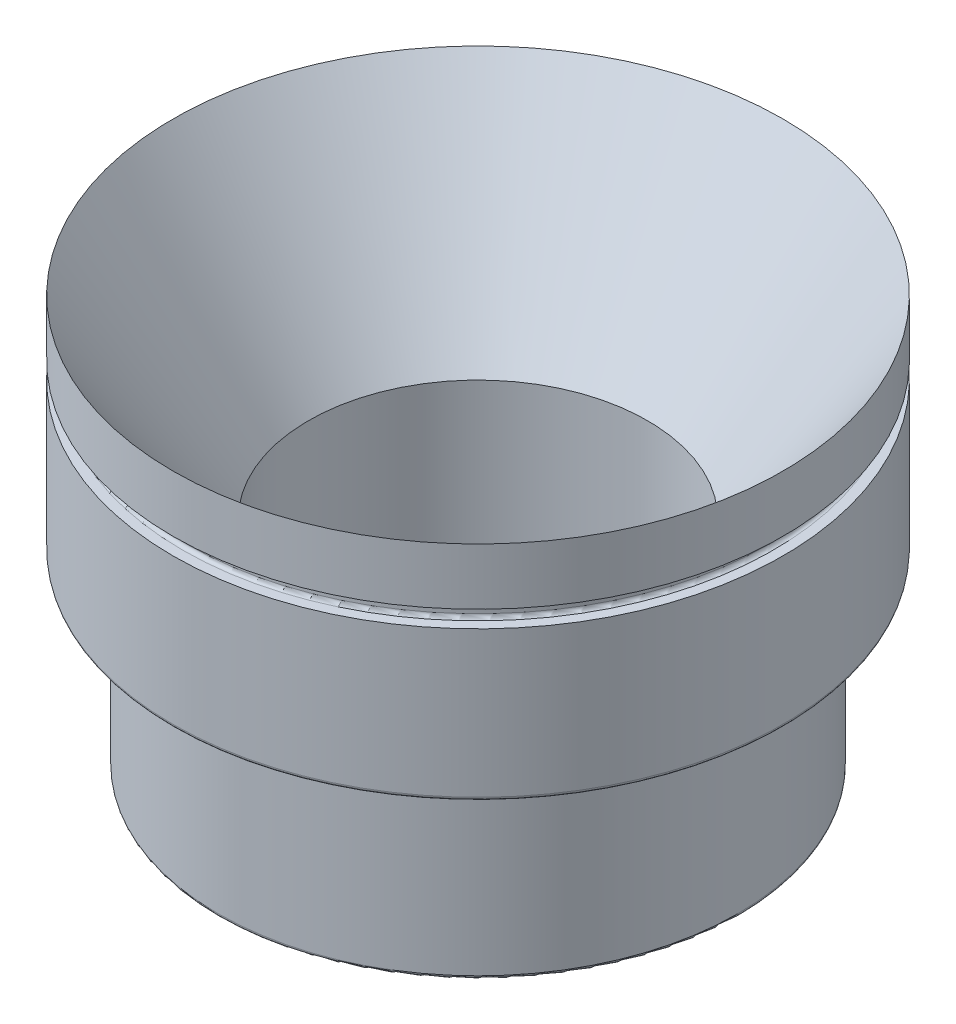
ISO-10303-21;
HEADER;
FILE_DESCRIPTION(('STEP AP214'),'2;1');
FILE_NAME('part.step','',(''),(''),'','','');
FILE_SCHEMA(('AUTOMOTIVE_DESIGN { 1 0 10303 214 1 1 1 1 }'));
ENDSEC;
DATA;
#1=APPLICATION_CONTEXT('core data for automotive mechanical design processes');
#2=APPLICATION_PROTOCOL_DEFINITION('international standard','automotive_design',2000,#1);
#3=PRODUCT_CONTEXT('',#1,'mechanical');
#4=PRODUCT('Part','Part','',(#3));
#5=PRODUCT_RELATED_PRODUCT_CATEGORY('part','',(#4));
#6=PRODUCT_DEFINITION_FORMATION('','',#4);
#7=PRODUCT_DEFINITION_CONTEXT('part definition',#1,'design');
#8=PRODUCT_DEFINITION('design','',#6,#7);
#9=PRODUCT_DEFINITION_SHAPE('','',#8);
#10=(LENGTH_UNIT() NAMED_UNIT(*) SI_UNIT(.MILLI.,.METRE.));
#11=(NAMED_UNIT(*) PLANE_ANGLE_UNIT() SI_UNIT($,.RADIAN.));
#12=(NAMED_UNIT(*) SI_UNIT($,.STERADIAN.) SOLID_ANGLE_UNIT());
#13=UNCERTAINTY_MEASURE_WITH_UNIT(LENGTH_MEASURE(1.E-05),#10,'distance_accuracy_value','');
#14=(GEOMETRIC_REPRESENTATION_CONTEXT(3) GLOBAL_UNCERTAINTY_ASSIGNED_CONTEXT((#13)) GLOBAL_UNIT_ASSIGNED_CONTEXT((#10,
#11,#12)) REPRESENTATION_CONTEXT('',''));
#15=CARTESIAN_POINT('',(0.,0.,0.));
#16=DIRECTION('',(0.,0.,1.));
#17=DIRECTION('',(1.,0.,0.));
#18=AXIS2_PLACEMENT_3D('',#15,#16,#17);
#19=CARTESIAN_POINT('',(0.,0.,0.));
#20=DIRECTION('',(0.,1.,0.));
#21=DIRECTION('',(0.,0.,1.));
#22=AXIS2_PLACEMENT_3D('',#19,#20,#21);
#23=CYLINDRICAL_SURFACE('',#22,34.2773);
#24=CARTESIAN_POINT('',(0.,0.,0.));
#25=DIRECTION('',(0.,1.,0.));
#26=DIRECTION('',(0.,0.,1.));
#27=AXIS2_PLACEMENT_3D('',#24,#25,#26);
#28=CIRCLE('',#27,34.2773);
#29=CARTESIAN_POINT('',(0.,0.,34.2773));
#30=VERTEX_POINT('',#29);
#31=EDGE_CURVE('E78',#30,#30,#28,.T.);
#32=ORIENTED_EDGE('',*,*,#31,.F.);
#33=EDGE_LOOP('',(#32));
#34=FACE_BOUND('',#33,.T.);
#35=CARTESIAN_POINT('',(0.,-6.35,0.));
#36=DIRECTION('',(0.,1.,0.));
#37=DIRECTION('',(0.,0.,1.));
#38=AXIS2_PLACEMENT_3D('',#35,#36,#37);
#39=CIRCLE('',#38,34.2773);
#40=CARTESIAN_POINT('',(0.,-6.35000000000001,34.2773));
#41=VERTEX_POINT('',#40);
#42=EDGE_CURVE('E87',#41,#41,#39,.T.);
#43=ORIENTED_EDGE('',*,*,#42,.T.);
#44=EDGE_LOOP('',(#43));
#45=FACE_BOUND('',#44,.T.);
#46=ADVANCED_FACE('F37',(#34,#45),#23,.T.);
#47=CARTESIAN_POINT('',(0.,-24.6440568424667,0.));
#48=DIRECTION('',(0.,1.,0.));
#49=DIRECTION('',(0.,0.,1.));
#50=AXIS2_PLACEMENT_3D('',#47,#48,#49);
#51=CIRCLE('',#50,34.2773);
#52=CARTESIAN_POINT('',(0.,-24.6440568424667,34.2773));
#53=VERTEX_POINT('',#52);
#54=EDGE_CURVE('E10',#53,#53,#51,.T.);
#55=ORIENTED_EDGE('',*,*,#54,.T.);
#56=EDGE_LOOP('',(#55));
#57=FACE_BOUND('',#56,.T.);
#58=CARTESIAN_POINT('',(0.,-8.25500000000001,0.));
#59=DIRECTION('',(0.,1.,0.));
#60=DIRECTION('',(0.,0.,1.));
#61=AXIS2_PLACEMENT_3D('',#58,#59,#60);
#62=CIRCLE('',#61,34.2773);
#63=CARTESIAN_POINT('',(0.,-8.25500000000001,34.2773));
#64=VERTEX_POINT('',#63);
#65=EDGE_CURVE('E90',#64,#64,#62,.T.);
#66=ORIENTED_EDGE('',*,*,#65,.F.);
#67=EDGE_LOOP('',(#66));
#68=FACE_BOUND('',#67,.T.);
#69=ADVANCED_FACE('F96',(#57,#68),#23,.T.);
#70=CARTESIAN_POINT('',(0.,0.,0.));
#71=DIRECTION('',(0.,1.,0.));
#72=DIRECTION('',(0.,0.,1.));
#73=AXIS2_PLACEMENT_3D('',#70,#71,#72);
#74=CYLINDRICAL_SURFACE('',#73,19.05);
#75=CARTESIAN_POINT('',(0.,-38.1492575019381,0.));
#76=DIRECTION('',(0.,1.,0.));
#77=DIRECTION('',(0.,0.,1.));
#78=AXIS2_PLACEMENT_3D('',#75,#76,#77);
#79=CIRCLE('',#78,19.05);
#80=CARTESIAN_POINT('',(0.,-38.1492575019381,19.05));
#81=VERTEX_POINT('',#80);
#82=EDGE_CURVE('E84',#81,#81,#79,.T.);
#83=ORIENTED_EDGE('',*,*,#82,.F.);
#84=EDGE_LOOP('',(#83));
#85=FACE_BOUND('',#84,.T.);
#86=CARTESIAN_POINT('',(0.,-21.7468381430641,0.));
#87=DIRECTION('',(0.,1.,0.));
#88=DIRECTION('',(0.,0.,1.));
#89=AXIS2_PLACEMENT_3D('',#86,#87,#88);
#90=CIRCLE('',#89,19.05);
#91=CARTESIAN_POINT('',(0.,-21.7468381430641,19.05));
#92=VERTEX_POINT('',#91);
#93=EDGE_CURVE('E75',#92,#92,#90,.T.);
#94=ORIENTED_EDGE('',*,*,#93,.T.);
#95=EDGE_LOOP('',(#94));
#96=FACE_BOUND('',#95,.T.);
#97=ADVANCED_FACE('F98',(#85,#96),#74,.F.);
#98=CARTESIAN_POINT('',(0.,0.,0.));
#99=DIRECTION('',(0.,1.,0.));
#100=DIRECTION('',(0.,0.,1.));
#101=AXIS2_PLACEMENT_3D('',#98,#99,#100);
#102=CONICAL_SURFACE('',#101,34.2773,0.610865238198017);
#103=ORIENTED_EDGE('',*,*,#93,.F.);
#104=EDGE_LOOP('',(#103));
#105=FACE_BOUND('',#104,.T.);
#106=ORIENTED_EDGE('',*,*,#31,.T.);
#107=EDGE_LOOP('',(#106));
#108=FACE_BOUND('',#107,.T.);
#109=ADVANCED_FACE('F105',(#105,#108),#102,.F.);
#110=CARTESIAN_POINT('',(0.,-25.0504568424667,-34.2773));
#111=DIRECTION('',(0.,1.,0.));
#112=DIRECTION('',(0.,0.,1.));
#113=AXIS2_PLACEMENT_3D('',#110,#111,#112);
#114=PLANE('',#113);
#115=CARTESIAN_POINT('',(0.,-25.0504568424667,0.));
#116=DIRECTION('',(0.,1.,0.));
#117=DIRECTION('',(0.,0.,1.));
#118=AXIS2_PLACEMENT_3D('',#115,#116,#117);
#119=CIRCLE('',#118,29.591);
#120=CARTESIAN_POINT('',(0.,-25.0504568424667,29.591));
#121=VERTEX_POINT('',#120);
#122=EDGE_CURVE('E57',#121,#121,#119,.T.);
#123=ORIENTED_EDGE('',*,*,#122,.T.);
#124=EDGE_LOOP('',(#123));
#125=FACE_BOUND('',#124,.T.);
#126=CARTESIAN_POINT('',(0.,-25.0504568424667,0.));
#127=DIRECTION('',(0.,1.,0.));
#128=DIRECTION('',(0.,0.,1.));
#129=AXIS2_PLACEMENT_3D('',#126,#127,#128);
#130=CIRCLE('',#129,33.8709);
#131=CARTESIAN_POINT('',(0.,-25.0504568424667,33.8709));
#132=VERTEX_POINT('',#131);
#133=EDGE_CURVE('E60',#132,#132,#130,.F.);
#134=ORIENTED_EDGE('',*,*,#133,.T.);
#135=EDGE_LOOP('',(#134));
#136=FACE_BOUND('',#135,.T.);
#137=ADVANCED_FACE('F111',(#125,#136),#114,.F.);
#138=CARTESIAN_POINT('',(0.,0.,0.));
#139=DIRECTION('',(0.,1.,0.));
#140=DIRECTION('',(0.,0.,1.));
#141=AXIS2_PLACEMENT_3D('',#138,#139,#140);
#142=CYLINDRICAL_SURFACE('',#141,29.1846);
#143=CARTESIAN_POINT('',(0.,-25.4568568424667,0.));
#144=DIRECTION('',(0.,1.,0.));
#145=DIRECTION('',(0.,0.,1.));
#146=AXIS2_PLACEMENT_3D('',#143,#144,#145);
#147=CIRCLE('',#146,29.1846);
#148=CARTESIAN_POINT('',(0.,-25.4568568424667,29.1846));
#149=VERTEX_POINT('',#148);
#150=EDGE_CURVE('E48',#149,#149,#147,.F.);
#151=ORIENTED_EDGE('',*,*,#150,.T.);
#152=EDGE_LOOP('',(#151));
#153=FACE_BOUND('',#152,.T.);
#154=CARTESIAN_POINT('',(0.,-45.6244568418987,0.));
#155=DIRECTION('',(0.,1.,0.));
#156=DIRECTION('',(0.,0.,1.));
#157=AXIS2_PLACEMENT_3D('',#154,#155,#156);
#158=CIRCLE('',#157,29.1846);
#159=CARTESIAN_POINT('',(0.,-45.6244568418987,29.1846));
#160=VERTEX_POINT('',#159);
#161=EDGE_CURVE('E52',#160,#160,#158,.T.);
#162=ORIENTED_EDGE('',*,*,#161,.T.);
#163=EDGE_LOOP('',(#162));
#164=FACE_BOUND('',#163,.T.);
#165=ADVANCED_FACE('F137',(#153,#164),#142,.T.);
#166=CARTESIAN_POINT('',(0.,-46.0308568418987,-29.1846));
#167=DIRECTION('',(0.,1.,0.));
#168=DIRECTION('',(0.,0.,1.));
#169=AXIS2_PLACEMENT_3D('',#166,#167,#168);
#170=PLANE('',#169);
#171=CARTESIAN_POINT('',(0.,-46.0308568418987,0.));
#172=DIRECTION('',(0.,1.,0.));
#173=DIRECTION('',(0.,0.,1.));
#174=AXIS2_PLACEMENT_3D('',#171,#172,#173);
#175=CIRCLE('',#174,28.7782);
#176=CARTESIAN_POINT('',(0.,-46.0308568418987,28.7782));
#177=VERTEX_POINT('',#176);
#178=EDGE_CURVE('E44',#177,#177,#175,.F.);
#179=ORIENTED_EDGE('',*,*,#178,.T.);
#180=EDGE_LOOP('',(#179));
#181=FACE_BOUND('',#180,.T.);
#182=CARTESIAN_POINT('',(0.,-46.0308568418987,0.));
#183=DIRECTION('',(0.,1.,0.));
#184=DIRECTION('',(0.,0.,1.));
#185=AXIS2_PLACEMENT_3D('',#182,#183,#184);
#186=CIRCLE('',#185,20.3822334431976);
#187=CARTESIAN_POINT('',(0.,-46.0308568418987,20.3822334431976));
#188=VERTEX_POINT('',#187);
#189=EDGE_CURVE('E81',#188,#188,#186,.T.);
#190=ORIENTED_EDGE('',*,*,#189,.T.);
#191=EDGE_LOOP('',(#190));
#192=FACE_BOUND('',#191,.T.);
#193=ADVANCED_FACE('F139',(#181,#192),#170,.F.);
#194=CARTESIAN_POINT('',(0.,-38.1492575019381,0.));
#195=DIRECTION('',(0.,-1.,0.));
#196=DIRECTION('',(0.,0.,-1.));
#197=AXIS2_PLACEMENT_3D('',#194,#195,#196);
#198=CONICAL_SURFACE('',#197,19.05,0.167448079213641);
#199=ORIENTED_EDGE('',*,*,#189,.F.);
#200=EDGE_LOOP('',(#199));
#201=FACE_BOUND('',#200,.T.);
#202=ORIENTED_EDGE('',*,*,#82,.T.);
#203=EDGE_LOOP('',(#202));
#204=FACE_BOUND('',#203,.T.);
#205=ADVANCED_FACE('F144',(#201,#204),#198,.F.);
#206=CARTESIAN_POINT('',(0.,-6.35,-34.2773));
#207=DIRECTION('',(0.,-1.,0.));
#208=DIRECTION('',(0.,0.,-1.));
#209=AXIS2_PLACEMENT_3D('',#206,#207,#208);
#210=PLANE('',#209);
#211=CARTESIAN_POINT('',(0.,-6.35,0.));
#212=DIRECTION('',(0.,-1.,0.));
#213=DIRECTION('',(0.,0.,-1.));
#214=AXIS2_PLACEMENT_3D('',#211,#212,#213);
#215=CIRCLE('',#214,33.1724);
#216=CARTESIAN_POINT('',(0.,-6.35,-33.1724));
#217=VERTEX_POINT('',#216);
#218=EDGE_CURVE('E72',#217,#217,#215,.F.);
#219=ORIENTED_EDGE('',*,*,#218,.T.);
#220=EDGE_LOOP('',(#219));
#221=FACE_BOUND('',#220,.T.);
#222=ORIENTED_EDGE('',*,*,#42,.F.);
#223=EDGE_LOOP('',(#222));
#224=FACE_BOUND('',#223,.T.);
#225=ADVANCED_FACE('F150',(#221,#224),#210,.T.);
#226=CARTESIAN_POINT('',(0.,11.364369062704,0.));
#227=DIRECTION('',(0.,1.,0.));
#228=DIRECTION('',(0.,0.,1.));
#229=AXIS2_PLACEMENT_3D('',#226,#227,#228);
#230=CYLINDRICAL_SURFACE('',#229,32.766);
#231=CARTESIAN_POINT('',(0.,-6.7564,0.));
#232=DIRECTION('',(0.,-1.,0.));
#233=DIRECTION('',(0.,0.,-1.));
#234=AXIS2_PLACEMENT_3D('',#231,#232,#233);
#235=CIRCLE('',#234,32.766);
#236=CARTESIAN_POINT('',(0.,-6.7564,-32.766));
#237=VERTEX_POINT('',#236);
#238=EDGE_CURVE('E66',#237,#237,#235,.T.);
#239=ORIENTED_EDGE('',*,*,#238,.T.);
#240=EDGE_LOOP('',(#239));
#241=FACE_BOUND('',#240,.T.);
#242=CARTESIAN_POINT('',(0.,-7.8486,0.));
#243=DIRECTION('',(0.,1.,0.));
#244=DIRECTION('',(0.,0.,1.));
#245=AXIS2_PLACEMENT_3D('',#242,#243,#244);
#246=CIRCLE('',#245,32.766);
#247=CARTESIAN_POINT('',(0.,-7.84860000000001,32.766));
#248=VERTEX_POINT('',#247);
#249=EDGE_CURVE('E69',#248,#248,#246,.T.);
#250=ORIENTED_EDGE('',*,*,#249,.T.);
#251=EDGE_LOOP('',(#250));
#252=FACE_BOUND('',#251,.T.);
#253=ADVANCED_FACE('F154',(#241,#252),#230,.T.);
#254=CARTESIAN_POINT('',(0.,-8.255,-32.766));
#255=DIRECTION('',(0.,1.,0.));
#256=DIRECTION('',(0.,0.,1.));
#257=AXIS2_PLACEMENT_3D('',#254,#255,#256);
#258=PLANE('',#257);
#259=CARTESIAN_POINT('',(0.,-8.25500000000001,0.));
#260=DIRECTION('',(0.,1.,0.));
#261=DIRECTION('',(0.,0.,1.));
#262=AXIS2_PLACEMENT_3D('',#259,#260,#261);
#263=CIRCLE('',#262,33.1724);
#264=CARTESIAN_POINT('',(0.,-8.25500000000001,33.1724));
#265=VERTEX_POINT('',#264);
#266=EDGE_CURVE('E63',#265,#265,#263,.F.);
#267=ORIENTED_EDGE('',*,*,#266,.T.);
#268=EDGE_LOOP('',(#267));
#269=FACE_BOUND('',#268,.T.);
#270=ORIENTED_EDGE('',*,*,#65,.T.);
#271=EDGE_LOOP('',(#270));
#272=FACE_BOUND('',#271,.T.);
#273=ADVANCED_FACE('F94',(#269,#272),#258,.T.);
#274=CARTESIAN_POINT('',(0.,-6.7564,0.));
#275=DIRECTION('',(0.,-1.,0.));
#276=DIRECTION('',(0.,0.,-1.));
#277=AXIS2_PLACEMENT_3D('',#274,#275,#276);
#278=TOROIDAL_SURFACE('',#277,33.1724,0.4064);
#279=ORIENTED_EDGE('',*,*,#238,.F.);
#280=EDGE_LOOP('',(#279));
#281=FACE_BOUND('',#280,.T.);
#282=ORIENTED_EDGE('',*,*,#218,.F.);
#283=EDGE_LOOP('',(#282));
#284=FACE_BOUND('',#283,.T.);
#285=ADVANCED_FACE('F116',(#281,#284),#278,.F.);
#286=CARTESIAN_POINT('',(0.,-7.8486,0.));
#287=DIRECTION('',(0.,1.,0.));
#288=DIRECTION('',(0.,0.,1.));
#289=AXIS2_PLACEMENT_3D('',#286,#287,#288);
#290=TOROIDAL_SURFACE('',#289,33.1724,0.4064);
#291=ORIENTED_EDGE('',*,*,#266,.F.);
#292=EDGE_LOOP('',(#291));
#293=FACE_BOUND('',#292,.T.);
#294=ORIENTED_EDGE('',*,*,#249,.F.);
#295=EDGE_LOOP('',(#294));
#296=FACE_BOUND('',#295,.T.);
#297=ADVANCED_FACE('F119',(#293,#296),#290,.F.);
#298=CARTESIAN_POINT('',(0.,-25.4568568424667,0.));
#299=DIRECTION('',(0.,1.,0.));
#300=DIRECTION('',(0.,0.,1.));
#301=AXIS2_PLACEMENT_3D('',#298,#299,#300);
#302=TOROIDAL_SURFACE('',#301,29.591,0.4064);
#303=ORIENTED_EDGE('',*,*,#150,.F.);
#304=EDGE_LOOP('',(#303));
#305=FACE_BOUND('',#304,.T.);
#306=ORIENTED_EDGE('',*,*,#122,.F.);
#307=EDGE_LOOP('',(#306));
#308=FACE_BOUND('',#307,.T.);
#309=ADVANCED_FACE('F123',(#305,#308),#302,.F.);
#310=CARTESIAN_POINT('',(0.,-45.6244568418987,0.));
#311=DIRECTION('',(0.,1.,0.));
#312=DIRECTION('',(0.,0.,1.));
#313=AXIS2_PLACEMENT_3D('',#310,#311,#312);
#314=TOROIDAL_SURFACE('',#313,28.7782,0.4064);
#315=ORIENTED_EDGE('',*,*,#178,.F.);
#316=EDGE_LOOP('',(#315));
#317=FACE_BOUND('',#316,.T.);
#318=ORIENTED_EDGE('',*,*,#161,.F.);
#319=EDGE_LOOP('',(#318));
#320=FACE_BOUND('',#319,.T.);
#321=ADVANCED_FACE('F126',(#317,#320),#314,.T.);
#322=CARTESIAN_POINT('',(0.,-24.6440568424667,0.));
#323=DIRECTION('',(0.,1.,0.));
#324=DIRECTION('',(0.,0.,1.));
#325=AXIS2_PLACEMENT_3D('',#322,#323,#324);
#326=TOROIDAL_SURFACE('',#325,33.8709,0.4064);
#327=ORIENTED_EDGE('',*,*,#133,.F.);
#328=EDGE_LOOP('',(#327));
#329=FACE_BOUND('',#328,.T.);
#330=ORIENTED_EDGE('',*,*,#54,.F.);
#331=EDGE_LOOP('',(#330));
#332=FACE_BOUND('',#331,.T.);
#333=ADVANCED_FACE('F39',(#329,#332),#326,.T.);
#334=CLOSED_SHELL('',(#46,#69,#97,#109,#137,#165,#193,#205,#225,#253,#273,#285,#297,#309,#321,#333));
#335=MANIFOLD_SOLID_BREP('B2',#334);
#336=ADVANCED_BREP_SHAPE_REPRESENTATION('',(#18,#335),#14);
#337=SHAPE_DEFINITION_REPRESENTATION(#9,#336);
ENDSEC;
END-ISO-10303-21;
